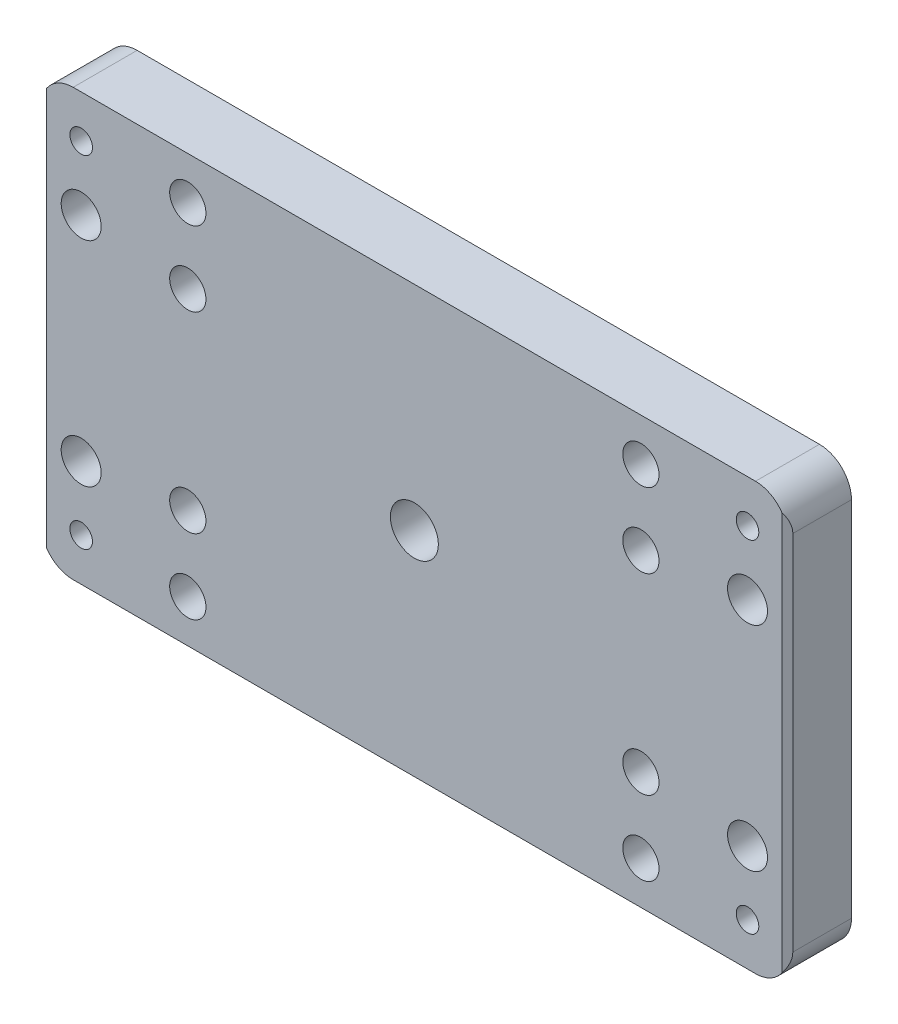
ISO-10303-21;
HEADER;
FILE_DESCRIPTION(('STEP AP214'),'2;1');
FILE_NAME('part.step','',(''),(''),'','','');
FILE_SCHEMA(('AUTOMOTIVE_DESIGN { 1 0 10303 214 1 1 1 1 }'));
ENDSEC;
DATA;
#1=APPLICATION_CONTEXT('core data for automotive mechanical design processes');
#2=APPLICATION_PROTOCOL_DEFINITION('international standard','automotive_design',2000,#1);
#3=PRODUCT_CONTEXT('',#1,'mechanical');
#4=PRODUCT('Part','Part','',(#3));
#5=PRODUCT_RELATED_PRODUCT_CATEGORY('part','',(#4));
#6=PRODUCT_DEFINITION_FORMATION('','',#4);
#7=PRODUCT_DEFINITION_CONTEXT('part definition',#1,'design');
#8=PRODUCT_DEFINITION('design','',#6,#7);
#9=PRODUCT_DEFINITION_SHAPE('','',#8);
#10=(LENGTH_UNIT() NAMED_UNIT(*) SI_UNIT(.MILLI.,.METRE.));
#11=(NAMED_UNIT(*) PLANE_ANGLE_UNIT() SI_UNIT($,.RADIAN.));
#12=(NAMED_UNIT(*) SI_UNIT($,.STERADIAN.) SOLID_ANGLE_UNIT());
#13=UNCERTAINTY_MEASURE_WITH_UNIT(LENGTH_MEASURE(1.E-05),#10,'distance_accuracy_value','');
#14=(GEOMETRIC_REPRESENTATION_CONTEXT(3) GLOBAL_UNCERTAINTY_ASSIGNED_CONTEXT((#13)) GLOBAL_UNIT_ASSIGNED_CONTEXT((#10,
#11,#12)) REPRESENTATION_CONTEXT('',''));
#15=CARTESIAN_POINT('',(0.,0.,0.));
#16=DIRECTION('',(0.,0.,1.));
#17=DIRECTION('',(1.,0.,0.));
#18=AXIS2_PLACEMENT_3D('',#15,#16,#17);
#19=CARTESIAN_POINT('',(0.,0.,12.));
#20=DIRECTION('',(0.,0.,-1.));
#21=DIRECTION('',(-1.,0.,0.));
#22=AXIS2_PLACEMENT_3D('',#19,#20,#21);
#23=PLANE('',#22);
#24=CARTESIAN_POINT('',(-42.5000023711444,32.,12.));
#25=DIRECTION('',(0.,0.,1.));
#26=DIRECTION('',(1.,0.,0.));
#27=AXIS2_PLACEMENT_3D('',#24,#25,#26);
#28=CIRCLE('',#27,3.4);
#29=CARTESIAN_POINT('',(-39.1000023711444,32.,12.));
#30=VERTEX_POINT('',#29);
#31=EDGE_CURVE('E659',#30,#30,#28,.T.);
#32=ORIENTED_EDGE('',*,*,#31,.F.);
#33=EDGE_LOOP('',(#32));
#34=FACE_BOUND('',#33,.T.);
#35=CARTESIAN_POINT('',(-42.5000023711445,18.,12.));
#36=DIRECTION('',(0.,0.,1.));
#37=DIRECTION('',(1.,0.,0.));
#38=AXIS2_PLACEMENT_3D('',#35,#36,#37);
#39=CIRCLE('',#38,3.4);
#40=CARTESIAN_POINT('',(-39.1000023711445,18.,12.));
#41=VERTEX_POINT('',#40);
#42=EDGE_CURVE('E666',#41,#41,#39,.T.);
#43=ORIENTED_EDGE('',*,*,#42,.F.);
#44=EDGE_LOOP('',(#43));
#45=FACE_BOUND('',#44,.T.);
#46=CARTESIAN_POINT('',(42.4999976288555,17.9999999999982,12.));
#47=DIRECTION('',(0.,0.,1.));
#48=DIRECTION('',(1.,0.,0.));
#49=AXIS2_PLACEMENT_3D('',#46,#47,#48);
#50=CIRCLE('',#49,3.4);
#51=CARTESIAN_POINT('',(45.8999976288555,17.9999999999982,12.));
#52=VERTEX_POINT('',#51);
#53=EDGE_CURVE('E673',#52,#52,#50,.T.);
#54=ORIENTED_EDGE('',*,*,#53,.F.);
#55=EDGE_LOOP('',(#54));
#56=FACE_BOUND('',#55,.T.);
#57=CARTESIAN_POINT('',(42.4999976288556,-18.0000000000018,12.));
#58=DIRECTION('',(0.,0.,1.));
#59=DIRECTION('',(1.,0.,0.));
#60=AXIS2_PLACEMENT_3D('',#57,#58,#59);
#61=CIRCLE('',#60,3.4);
#62=CARTESIAN_POINT('',(45.8999976288556,-18.0000000000018,12.));
#63=VERTEX_POINT('',#62);
#64=EDGE_CURVE('E624',#63,#63,#61,.T.);
#65=ORIENTED_EDGE('',*,*,#64,.F.);
#66=EDGE_LOOP('',(#65));
#67=FACE_BOUND('',#66,.T.);
#68=CARTESIAN_POINT('',(42.4999976288555,-32.0000000000018,12.));
#69=DIRECTION('',(0.,0.,1.));
#70=DIRECTION('',(1.,0.,0.));
#71=AXIS2_PLACEMENT_3D('',#68,#69,#70);
#72=CIRCLE('',#71,3.4);
#73=CARTESIAN_POINT('',(45.8999976288555,-32.0000000000018,12.));
#74=VERTEX_POINT('',#73);
#75=EDGE_CURVE('E632',#74,#74,#72,.T.);
#76=ORIENTED_EDGE('',*,*,#75,.F.);
#77=EDGE_LOOP('',(#76));
#78=FACE_BOUND('',#77,.T.);
#79=CARTESIAN_POINT('',(-42.5000023711445,-32.,12.));
#80=DIRECTION('',(0.,0.,1.));
#81=DIRECTION('',(1.,0.,0.));
#82=AXIS2_PLACEMENT_3D('',#79,#80,#81);
#83=CIRCLE('',#82,3.4);
#84=CARTESIAN_POINT('',(-39.1000023711445,-32.,12.));
#85=VERTEX_POINT('',#84);
#86=EDGE_CURVE('E641',#85,#85,#83,.T.);
#87=ORIENTED_EDGE('',*,*,#86,.F.);
#88=EDGE_LOOP('',(#87));
#89=FACE_BOUND('',#88,.T.);
#90=CARTESIAN_POINT('',(-42.5000023711444,-18.,12.));
#91=DIRECTION('',(0.,0.,1.));
#92=DIRECTION('',(1.,0.,0.));
#93=AXIS2_PLACEMENT_3D('',#90,#91,#92);
#94=CIRCLE('',#93,3.4);
#95=CARTESIAN_POINT('',(-39.1000023711444,-18.,12.));
#96=VERTEX_POINT('',#95);
#97=EDGE_CURVE('E653',#96,#96,#94,.T.);
#98=ORIENTED_EDGE('',*,*,#97,.F.);
#99=EDGE_LOOP('',(#98));
#100=FACE_BOUND('',#99,.T.);
#101=CARTESIAN_POINT('',(42.4999976288556,31.9999999999982,12.));
#102=DIRECTION('',(0.,0.,1.));
#103=DIRECTION('',(1.,0.,0.));
#104=AXIS2_PLACEMENT_3D('',#101,#102,#103);
#105=CIRCLE('',#104,3.4);
#106=CARTESIAN_POINT('',(45.8999976288556,31.9999999999982,12.));
#107=VERTEX_POINT('',#106);
#108=EDGE_CURVE('E577',#107,#107,#105,.T.);
#109=ORIENTED_EDGE('',*,*,#108,.F.);
#110=EDGE_LOOP('',(#109));
#111=FACE_BOUND('',#110,.T.);
#112=CARTESIAN_POINT('',(64.,-34.0000000000002,12.));
#113=DIRECTION('',(0.,0.,-1.));
#114=DIRECTION('',(-1.,0.,0.));
#115=AXIS2_PLACEMENT_3D('',#112,#113,#114);
#116=CIRCLE('',#115,6.);
#117=CARTESIAN_POINT('',(64.,-40.0000000000002,12.));
#118=VERTEX_POINT('',#117);
#119=CARTESIAN_POINT('',(69.,-37.3166247903556,12.));
#120=VERTEX_POINT('',#119);
#121=EDGE_CURVE('E187',#118,#120,#116,.F.);
#122=ORIENTED_EDGE('',*,*,#121,.T.);
#123=DIRECTION('',(0.,1.,0.));
#124=VECTOR('',#123,1.);
#125=CARTESIAN_POINT('',(69.,0.,12.));
#126=LINE('',#125,#124);
#127=CARTESIAN_POINT('',(69.,37.3166247903553,12.));
#128=VERTEX_POINT('',#127);
#129=EDGE_CURVE('E202',#120,#128,#126,.T.);
#130=ORIENTED_EDGE('',*,*,#129,.T.);
#131=CARTESIAN_POINT('',(64.,33.9999999999999,12.));
#132=DIRECTION('',(0.,0.,-1.));
#133=DIRECTION('',(-1.,0.,0.));
#134=AXIS2_PLACEMENT_3D('',#131,#132,#133);
#135=CIRCLE('',#134,6.);
#136=CARTESIAN_POINT('',(64.,39.9999999999999,12.));
#137=VERTEX_POINT('',#136);
#138=EDGE_CURVE('E185',#128,#137,#135,.F.);
#139=ORIENTED_EDGE('',*,*,#138,.T.);
#140=DIRECTION('',(-1.,0.,0.));
#141=VECTOR('',#140,1.);
#142=CARTESIAN_POINT('',(-70.,40.,12.));
#143=LINE('',#142,#141);
#144=CARTESIAN_POINT('',(-64.,40.,12.));
#145=VERTEX_POINT('',#144);
#146=EDGE_CURVE('E170',#137,#145,#143,.T.);
#147=ORIENTED_EDGE('',*,*,#146,.T.);
#148=CARTESIAN_POINT('',(-64.,34.,12.));
#149=DIRECTION('',(0.,0.,-1.));
#150=DIRECTION('',(-1.,0.,0.));
#151=AXIS2_PLACEMENT_3D('',#148,#149,#150);
#152=CIRCLE('',#151,6.);
#153=CARTESIAN_POINT('',(-69.,37.3166247903554,12.));
#154=VERTEX_POINT('',#153);
#155=EDGE_CURVE('E182',#145,#154,#152,.F.);
#156=ORIENTED_EDGE('',*,*,#155,.T.);
#157=DIRECTION('',(0.,-1.,0.));
#158=VECTOR('',#157,1.);
#159=CARTESIAN_POINT('',(-69.,0.,12.));
#160=LINE('',#159,#158);
#161=CARTESIAN_POINT('',(-69.,-37.3166247903556,12.));
#162=VERTEX_POINT('',#161);
#163=EDGE_CURVE('E199',#154,#162,#160,.T.);
#164=ORIENTED_EDGE('',*,*,#163,.T.);
#165=CARTESIAN_POINT('',(-64.,-34.0000000000002,12.));
#166=DIRECTION('',(0.,0.,-1.));
#167=DIRECTION('',(-1.,0.,0.));
#168=AXIS2_PLACEMENT_3D('',#165,#166,#167);
#169=CIRCLE('',#168,6.);
#170=CARTESIAN_POINT('',(-64.,-40.0000000000002,12.));
#171=VERTEX_POINT('',#170);
#172=EDGE_CURVE('E180',#162,#171,#169,.F.);
#173=ORIENTED_EDGE('',*,*,#172,.T.);
#174=DIRECTION('',(1.,0.,0.));
#175=VECTOR('',#174,1.);
#176=CARTESIAN_POINT('',(-70.,-40.0000000000002,12.));
#177=LINE('',#176,#175);
#178=EDGE_CURVE('E163',#171,#118,#177,.T.);
#179=ORIENTED_EDGE('',*,*,#178,.T.);
#180=EDGE_LOOP('',(#122,#130,#139,#147,#156,#164,#173,#179));
#181=FACE_BOUND('',#180,.T.);
#182=CARTESIAN_POINT('',(-62.499963670884,31.9999999999999,12.));
#183=DIRECTION('',(0.,0.,1.));
#184=DIRECTION('',(1.,0.,0.));
#185=AXIS2_PLACEMENT_3D('',#182,#183,#184);
#186=CIRCLE('',#185,2.11700000000003);
#187=CARTESIAN_POINT('',(-60.382963670884,31.9999999999999,12.));
#188=VERTEX_POINT('',#187);
#189=EDGE_CURVE('E153',#188,#188,#186,.T.);
#190=ORIENTED_EDGE('',*,*,#189,.F.);
#191=EDGE_LOOP('',(#190));
#192=FACE_BOUND('',#191,.T.);
#193=CARTESIAN_POINT('',(-62.5000023711479,20.0002132500231,12.));
#194=DIRECTION('',(0.,0.,1.));
#195=DIRECTION('',(1.,0.,0.));
#196=AXIS2_PLACEMENT_3D('',#193,#194,#195);
#197=CIRCLE('',#196,3.74999999999998);
#198=CARTESIAN_POINT('',(-58.750002371148,20.0002132500231,12.));
#199=VERTEX_POINT('',#198);
#200=EDGE_CURVE('E227',#199,#199,#197,.T.);
#201=ORIENTED_EDGE('',*,*,#200,.F.);
#202=EDGE_LOOP('',(#201));
#203=FACE_BOUND('',#202,.T.);
#204=CARTESIAN_POINT('',(-62.499963670884,-32.0000000000001,12.));
#205=DIRECTION('',(0.,0.,1.));
#206=DIRECTION('',(1.,0.,0.));
#207=AXIS2_PLACEMENT_3D('',#204,#205,#206);
#208=CIRCLE('',#207,2.11700000000003);
#209=CARTESIAN_POINT('',(-60.382963670884,-32.0000000000001,12.));
#210=VERTEX_POINT('',#209);
#211=EDGE_CURVE('E719',#210,#210,#208,.T.);
#212=ORIENTED_EDGE('',*,*,#211,.F.);
#213=EDGE_LOOP('',(#212));
#214=FACE_BOUND('',#213,.T.);
#215=CARTESIAN_POINT('',(-62.5000023711469,-19.9997867499768,12.));
#216=DIRECTION('',(0.,0.,1.));
#217=DIRECTION('',(1.,0.,0.));
#218=AXIS2_PLACEMENT_3D('',#215,#216,#217);
#219=CIRCLE('',#218,3.74999999999998);
#220=CARTESIAN_POINT('',(-58.750002371147,-19.9997867499768,12.));
#221=VERTEX_POINT('',#220);
#222=EDGE_CURVE('E726',#221,#221,#219,.T.);
#223=ORIENTED_EDGE('',*,*,#222,.F.);
#224=EDGE_LOOP('',(#223));
#225=FACE_BOUND('',#224,.T.);
#226=CARTESIAN_POINT('',(0.,0.,12.));
#227=DIRECTION('',(0.,0.,1.));
#228=DIRECTION('',(1.,0.,0.));
#229=AXIS2_PLACEMENT_3D('',#226,#227,#228);
#230=CIRCLE('',#229,4.49999999999999);
#231=CARTESIAN_POINT('',(4.50000000000002,0.,12.));
#232=VERTEX_POINT('',#231);
#233=EDGE_CURVE('E604',#232,#232,#230,.T.);
#234=ORIENTED_EDGE('',*,*,#233,.F.);
#235=EDGE_LOOP('',(#234));
#236=FACE_BOUND('',#235,.T.);
#237=CARTESIAN_POINT('',(62.499963670884,31.9999999999999,12.));
#238=DIRECTION('',(0.,0.,1.));
#239=DIRECTION('',(1.,0.,0.));
#240=AXIS2_PLACEMENT_3D('',#237,#238,#239);
#241=CIRCLE('',#240,2.117);
#242=CARTESIAN_POINT('',(64.616963670884,31.9999999999999,12.));
#243=VERTEX_POINT('',#242);
#244=EDGE_CURVE('E597',#243,#243,#241,.T.);
#245=ORIENTED_EDGE('',*,*,#244,.F.);
#246=EDGE_LOOP('',(#245));
#247=FACE_BOUND('',#246,.T.);
#248=CARTESIAN_POINT('',(62.499997628858,20.0002132500231,12.));
#249=DIRECTION('',(0.,0.,1.));
#250=DIRECTION('',(1.,0.,0.));
#251=AXIS2_PLACEMENT_3D('',#248,#249,#250);
#252=CIRCLE('',#251,3.75);
#253=CARTESIAN_POINT('',(66.249997628858,20.0002132500231,12.));
#254=VERTEX_POINT('',#253);
#255=EDGE_CURVE('E591',#254,#254,#252,.T.);
#256=ORIENTED_EDGE('',*,*,#255,.F.);
#257=EDGE_LOOP('',(#256));
#258=FACE_BOUND('',#257,.T.);
#259=CARTESIAN_POINT('',(62.499997628858,-19.9997867499768,12.));
#260=DIRECTION('',(0.,0.,1.));
#261=DIRECTION('',(1.,0.,0.));
#262=AXIS2_PLACEMENT_3D('',#259,#260,#261);
#263=CIRCLE('',#262,3.75000000000001);
#264=CARTESIAN_POINT('',(66.249997628858,-19.9997867499768,12.));
#265=VERTEX_POINT('',#264);
#266=EDGE_CURVE('E582',#265,#265,#263,.T.);
#267=ORIENTED_EDGE('',*,*,#266,.F.);
#268=EDGE_LOOP('',(#267));
#269=FACE_BOUND('',#268,.T.);
#270=CARTESIAN_POINT('',(62.499963670884,-32.0000000000001,12.));
#271=DIRECTION('',(0.,0.,1.));
#272=DIRECTION('',(1.,0.,0.));
#273=AXIS2_PLACEMENT_3D('',#270,#271,#272);
#274=CIRCLE('',#273,2.117);
#275=CARTESIAN_POINT('',(64.616963670884,-32.0000000000001,12.));
#276=VERTEX_POINT('',#275);
#277=EDGE_CURVE('E569',#276,#276,#274,.T.);
#278=ORIENTED_EDGE('',*,*,#277,.F.);
#279=EDGE_LOOP('',(#278));
#280=FACE_BOUND('',#279,.T.);
#281=ADVANCED_FACE('F45',(#34,#45,#56,#67,#78,#89,#100,#111,#181,#192,#203,#214,#225,#236,#247,
#258,#269,#280),#23,.F.);
#282=CARTESIAN_POINT('',(0.,0.,0.));
#283=DIRECTION('',(0.,0.,-1.));
#284=DIRECTION('',(-1.,0.,0.));
#285=AXIS2_PLACEMENT_3D('',#282,#283,#284);
#286=PLANE('',#285);
#287=CARTESIAN_POINT('',(-42.5000023711444,32.,0.));
#288=DIRECTION('',(0.,0.,1.));
#289=DIRECTION('',(1.,0.,0.));
#290=AXIS2_PLACEMENT_3D('',#287,#288,#289);
#291=CIRCLE('',#290,3.4);
#292=CARTESIAN_POINT('',(-39.1000023711444,32.,0.));
#293=VERTEX_POINT('',#292);
#294=EDGE_CURVE('E622',#293,#293,#291,.T.);
#295=ORIENTED_EDGE('',*,*,#294,.T.);
#296=EDGE_LOOP('',(#295));
#297=FACE_BOUND('',#296,.T.);
#298=CARTESIAN_POINT('',(-42.5000023711445,18.,0.));
#299=DIRECTION('',(0.,0.,1.));
#300=DIRECTION('',(1.,0.,0.));
#301=AXIS2_PLACEMENT_3D('',#298,#299,#300);
#302=CIRCLE('',#301,3.4);
#303=CARTESIAN_POINT('',(-39.1000023711445,18.,0.));
#304=VERTEX_POINT('',#303);
#305=EDGE_CURVE('E664',#304,#304,#302,.T.);
#306=ORIENTED_EDGE('',*,*,#305,.T.);
#307=EDGE_LOOP('',(#306));
#308=FACE_BOUND('',#307,.T.);
#309=CARTESIAN_POINT('',(42.4999976288555,17.9999999999982,0.));
#310=DIRECTION('',(0.,0.,1.));
#311=DIRECTION('',(1.,0.,0.));
#312=AXIS2_PLACEMENT_3D('',#309,#310,#311);
#313=CIRCLE('',#312,3.4);
#314=CARTESIAN_POINT('',(45.8999976288555,17.9999999999982,0.));
#315=VERTEX_POINT('',#314);
#316=EDGE_CURVE('E671',#315,#315,#313,.T.);
#317=ORIENTED_EDGE('',*,*,#316,.T.);
#318=EDGE_LOOP('',(#317));
#319=FACE_BOUND('',#318,.T.);
#320=CARTESIAN_POINT('',(42.4999976288556,-18.0000000000018,0.));
#321=DIRECTION('',(0.,0.,1.));
#322=DIRECTION('',(1.,0.,0.));
#323=AXIS2_PLACEMENT_3D('',#320,#321,#322);
#324=CIRCLE('',#323,3.4);
#325=CARTESIAN_POINT('',(45.8999976288556,-18.0000000000018,0.));
#326=VERTEX_POINT('',#325);
#327=EDGE_CURVE('E629',#326,#326,#324,.T.);
#328=ORIENTED_EDGE('',*,*,#327,.T.);
#329=EDGE_LOOP('',(#328));
#330=FACE_BOUND('',#329,.T.);
#331=CARTESIAN_POINT('',(42.4999976288555,-32.0000000000018,0.));
#332=DIRECTION('',(0.,0.,1.));
#333=DIRECTION('',(1.,0.,0.));
#334=AXIS2_PLACEMENT_3D('',#331,#332,#333);
#335=CIRCLE('',#334,3.4);
#336=CARTESIAN_POINT('',(45.8999976288555,-32.0000000000018,0.));
#337=VERTEX_POINT('',#336);
#338=EDGE_CURVE('E630',#337,#337,#335,.T.);
#339=ORIENTED_EDGE('',*,*,#338,.T.);
#340=EDGE_LOOP('',(#339));
#341=FACE_BOUND('',#340,.T.);
#342=CARTESIAN_POINT('',(-42.5000023711445,-32.,0.));
#343=DIRECTION('',(0.,0.,1.));
#344=DIRECTION('',(1.,0.,0.));
#345=AXIS2_PLACEMENT_3D('',#342,#343,#344);
#346=CIRCLE('',#345,3.4);
#347=CARTESIAN_POINT('',(-39.1000023711445,-32.,0.));
#348=VERTEX_POINT('',#347);
#349=EDGE_CURVE('E638',#348,#348,#346,.T.);
#350=ORIENTED_EDGE('',*,*,#349,.T.);
#351=EDGE_LOOP('',(#350));
#352=FACE_BOUND('',#351,.T.);
#353=CARTESIAN_POINT('',(-42.5000023711444,-18.,0.));
#354=DIRECTION('',(0.,0.,1.));
#355=DIRECTION('',(1.,0.,0.));
#356=AXIS2_PLACEMENT_3D('',#353,#354,#355);
#357=CIRCLE('',#356,3.4);
#358=CARTESIAN_POINT('',(-39.1000023711444,-18.,0.));
#359=VERTEX_POINT('',#358);
#360=EDGE_CURVE('E646',#359,#359,#357,.T.);
#361=ORIENTED_EDGE('',*,*,#360,.T.);
#362=EDGE_LOOP('',(#361));
#363=FACE_BOUND('',#362,.T.);
#364=CARTESIAN_POINT('',(42.4999976288556,31.9999999999982,0.));
#365=DIRECTION('',(0.,0.,1.));
#366=DIRECTION('',(1.,0.,0.));
#367=AXIS2_PLACEMENT_3D('',#364,#365,#366);
#368=CIRCLE('',#367,3.4);
#369=CARTESIAN_POINT('',(45.8999976288556,31.9999999999982,0.));
#370=VERTEX_POINT('',#369);
#371=EDGE_CURVE('E570',#370,#370,#368,.T.);
#372=ORIENTED_EDGE('',*,*,#371,.T.);
#373=EDGE_LOOP('',(#372));
#374=FACE_BOUND('',#373,.T.);
#375=CARTESIAN_POINT('',(62.499997628858,-19.9997867499768,0.));
#376=DIRECTION('',(0.,0.,1.));
#377=DIRECTION('',(1.,0.,0.));
#378=AXIS2_PLACEMENT_3D('',#375,#376,#377);
#379=CIRCLE('',#378,3.75000000000001);
#380=CARTESIAN_POINT('',(66.249997628858,-19.9997867499768,0.));
#381=VERTEX_POINT('',#380);
#382=EDGE_CURVE('E574',#381,#381,#379,.T.);
#383=ORIENTED_EDGE('',*,*,#382,.T.);
#384=EDGE_LOOP('',(#383));
#385=FACE_BOUND('',#384,.T.);
#386=CARTESIAN_POINT('',(62.499963670884,31.9999999999999,0.));
#387=DIRECTION('',(0.,0.,1.));
#388=DIRECTION('',(1.,0.,0.));
#389=AXIS2_PLACEMENT_3D('',#386,#387,#388);
#390=CIRCLE('',#389,2.117);
#391=CARTESIAN_POINT('',(64.616963670884,31.9999999999999,0.));
#392=VERTEX_POINT('',#391);
#393=EDGE_CURVE('E596',#392,#392,#390,.T.);
#394=ORIENTED_EDGE('',*,*,#393,.T.);
#395=EDGE_LOOP('',(#394));
#396=FACE_BOUND('',#395,.T.);
#397=CARTESIAN_POINT('',(-62.5000023711469,-19.9997867499768,0.));
#398=DIRECTION('',(0.,0.,1.));
#399=DIRECTION('',(1.,0.,0.));
#400=AXIS2_PLACEMENT_3D('',#397,#398,#399);
#401=CIRCLE('',#400,3.74999999999998);
#402=CARTESIAN_POINT('',(-58.750002371147,-19.9997867499768,0.));
#403=VERTEX_POINT('',#402);
#404=EDGE_CURVE('E609',#403,#403,#401,.T.);
#405=ORIENTED_EDGE('',*,*,#404,.T.);
#406=EDGE_LOOP('',(#405));
#407=FACE_BOUND('',#406,.T.);
#408=CARTESIAN_POINT('',(-62.5000023711479,20.0002132500231,0.));
#409=DIRECTION('',(0.,0.,1.));
#410=DIRECTION('',(1.,0.,0.));
#411=AXIS2_PLACEMENT_3D('',#408,#409,#410);
#412=CIRCLE('',#411,3.74999999999998);
#413=CARTESIAN_POINT('',(-58.750002371148,20.0002132500231,0.));
#414=VERTEX_POINT('',#413);
#415=EDGE_CURVE('E225',#414,#414,#412,.T.);
#416=ORIENTED_EDGE('',*,*,#415,.T.);
#417=EDGE_LOOP('',(#416));
#418=FACE_BOUND('',#417,.T.);
#419=DIRECTION('',(0.,1.,0.));
#420=VECTOR('',#419,1.);
#421=CARTESIAN_POINT('',(70.,-40.0000000000002,0.));
#422=LINE('',#421,#420);
#423=CARTESIAN_POINT('',(70.,-34.0000000000002,0.));
#424=VERTEX_POINT('',#423);
#425=CARTESIAN_POINT('',(70.,33.9999999999999,0.));
#426=VERTEX_POINT('',#425);
#427=EDGE_CURVE('E129',#424,#426,#422,.T.);
#428=ORIENTED_EDGE('',*,*,#427,.F.);
#429=CARTESIAN_POINT('',(64.,-34.0000000000002,0.));
#430=DIRECTION('',(0.,0.,-1.));
#431=DIRECTION('',(-1.,0.,0.));
#432=AXIS2_PLACEMENT_3D('',#429,#430,#431);
#433=CIRCLE('',#432,6.);
#434=CARTESIAN_POINT('',(64.,-40.0000000000002,0.));
#435=VERTEX_POINT('',#434);
#436=EDGE_CURVE('E139',#424,#435,#433,.T.);
#437=ORIENTED_EDGE('',*,*,#436,.T.);
#438=DIRECTION('',(1.,0.,0.));
#439=VECTOR('',#438,1.);
#440=CARTESIAN_POINT('',(-70.,-40.0000000000002,0.));
#441=LINE('',#440,#439);
#442=CARTESIAN_POINT('',(-64.,-40.0000000000002,0.));
#443=VERTEX_POINT('',#442);
#444=EDGE_CURVE('E168',#443,#435,#441,.T.);
#445=ORIENTED_EDGE('',*,*,#444,.F.);
#446=CARTESIAN_POINT('',(-64.,-34.0000000000002,0.));
#447=DIRECTION('',(0.,0.,-1.));
#448=DIRECTION('',(-1.,0.,0.));
#449=AXIS2_PLACEMENT_3D('',#446,#447,#448);
#450=CIRCLE('',#449,6.);
#451=CARTESIAN_POINT('',(-70.,-34.0000000000002,0.));
#452=VERTEX_POINT('',#451);
#453=EDGE_CURVE('E135',#443,#452,#450,.T.);
#454=ORIENTED_EDGE('',*,*,#453,.T.);
#455=DIRECTION('',(0.,-1.,0.));
#456=VECTOR('',#455,1.);
#457=CARTESIAN_POINT('',(-70.,-40.0000000000002,0.));
#458=LINE('',#457,#456);
#459=CARTESIAN_POINT('',(-70.,34.,0.));
#460=VERTEX_POINT('',#459);
#461=EDGE_CURVE('E156',#460,#452,#458,.T.);
#462=ORIENTED_EDGE('',*,*,#461,.F.);
#463=CARTESIAN_POINT('',(-64.,34.,0.));
#464=DIRECTION('',(0.,0.,-1.));
#465=DIRECTION('',(-1.,0.,0.));
#466=AXIS2_PLACEMENT_3D('',#463,#464,#465);
#467=CIRCLE('',#466,6.);
#468=CARTESIAN_POINT('',(-64.,40.,0.));
#469=VERTEX_POINT('',#468);
#470=EDGE_CURVE('E174',#460,#469,#467,.T.);
#471=ORIENTED_EDGE('',*,*,#470,.T.);
#472=DIRECTION('',(-1.,0.,0.));
#473=VECTOR('',#472,1.);
#474=CARTESIAN_POINT('',(-70.,40.,0.));
#475=LINE('',#474,#473);
#476=CARTESIAN_POINT('',(64.,39.9999999999999,0.));
#477=VERTEX_POINT('',#476);
#478=EDGE_CURVE('E152',#477,#469,#475,.T.);
#479=ORIENTED_EDGE('',*,*,#478,.F.);
#480=CARTESIAN_POINT('',(64.,33.9999999999999,0.));
#481=DIRECTION('',(0.,0.,-1.));
#482=DIRECTION('',(-1.,0.,0.));
#483=AXIS2_PLACEMENT_3D('',#480,#481,#482);
#484=CIRCLE('',#483,6.);
#485=EDGE_CURVE('E147',#477,#426,#484,.T.);
#486=ORIENTED_EDGE('',*,*,#485,.T.);
#487=EDGE_LOOP('',(#428,#437,#445,#454,#462,#471,#479,#486));
#488=FACE_BOUND('',#487,.T.);
#489=CARTESIAN_POINT('',(-62.499963670884,31.9999999999999,0.));
#490=DIRECTION('',(0.,0.,1.));
#491=DIRECTION('',(1.,0.,0.));
#492=AXIS2_PLACEMENT_3D('',#489,#490,#491);
#493=CIRCLE('',#492,2.11700000000003);
#494=CARTESIAN_POINT('',(-60.382963670884,31.9999999999999,0.));
#495=VERTEX_POINT('',#494);
#496=EDGE_CURVE('E160',#495,#495,#493,.T.);
#497=ORIENTED_EDGE('',*,*,#496,.T.);
#498=EDGE_LOOP('',(#497));
#499=FACE_BOUND('',#498,.T.);
#500=CARTESIAN_POINT('',(-62.499963670884,-32.0000000000001,0.));
#501=DIRECTION('',(0.,0.,1.));
#502=DIRECTION('',(1.,0.,0.));
#503=AXIS2_PLACEMENT_3D('',#500,#501,#502);
#504=CIRCLE('',#503,2.11700000000003);
#505=CARTESIAN_POINT('',(-60.382963670884,-32.0000000000001,0.));
#506=VERTEX_POINT('',#505);
#507=EDGE_CURVE('E556',#506,#506,#504,.T.);
#508=ORIENTED_EDGE('',*,*,#507,.T.);
#509=EDGE_LOOP('',(#508));
#510=FACE_BOUND('',#509,.T.);
#511=CARTESIAN_POINT('',(0.,0.,0.));
#512=DIRECTION('',(0.,0.,1.));
#513=DIRECTION('',(1.,0.,0.));
#514=AXIS2_PLACEMENT_3D('',#511,#512,#513);
#515=CIRCLE('',#514,4.49999999999999);
#516=CARTESIAN_POINT('',(4.50000000000002,0.,0.));
#517=VERTEX_POINT('',#516);
#518=EDGE_CURVE('E560',#517,#517,#515,.T.);
#519=ORIENTED_EDGE('',*,*,#518,.T.);
#520=EDGE_LOOP('',(#519));
#521=FACE_BOUND('',#520,.T.);
#522=CARTESIAN_POINT('',(62.499997628858,20.0002132500231,0.));
#523=DIRECTION('',(0.,0.,1.));
#524=DIRECTION('',(1.,0.,0.));
#525=AXIS2_PLACEMENT_3D('',#522,#523,#524);
#526=CIRCLE('',#525,3.75);
#527=CARTESIAN_POINT('',(66.249997628858,20.0002132500231,0.));
#528=VERTEX_POINT('',#527);
#529=EDGE_CURVE('E564',#528,#528,#526,.T.);
#530=ORIENTED_EDGE('',*,*,#529,.T.);
#531=EDGE_LOOP('',(#530));
#532=FACE_BOUND('',#531,.T.);
#533=CARTESIAN_POINT('',(62.499963670884,-32.0000000000001,0.));
#534=DIRECTION('',(0.,0.,1.));
#535=DIRECTION('',(1.,0.,0.));
#536=AXIS2_PLACEMENT_3D('',#533,#534,#535);
#537=CIRCLE('',#536,2.117);
#538=CARTESIAN_POINT('',(64.616963670884,-32.0000000000001,0.));
#539=VERTEX_POINT('',#538);
#540=EDGE_CURVE('E567',#539,#539,#537,.T.);
#541=ORIENTED_EDGE('',*,*,#540,.T.);
#542=EDGE_LOOP('',(#541));
#543=FACE_BOUND('',#542,.T.);
#544=ADVANCED_FACE('F149',(#297,#308,#319,#330,#341,#352,#363,#374,#385,#396,#407,#418,#488,
#499,#510,#521,#532,#543),#286,.T.);
#545=CARTESIAN_POINT('',(70.,-40.0000000000002,12.));
#546=DIRECTION('',(-1.,0.,0.));
#547=DIRECTION('',(0.,0.,1.));
#548=AXIS2_PLACEMENT_3D('',#545,#546,#547);
#549=PLANE('',#548);
#550=DIRECTION('',(0.,0.,-1.));
#551=VECTOR('',#550,1.);
#552=CARTESIAN_POINT('',(70.,33.9999999999999,12.));
#553=LINE('',#552,#551);
#554=CARTESIAN_POINT('',(70.,33.9999999999999,11.));
#555=VERTEX_POINT('',#554);
#556=EDGE_CURVE('E136',#426,#555,#553,.F.);
#557=ORIENTED_EDGE('',*,*,#556,.T.);
#558=DIRECTION('',(0.,-1.,0.));
#559=VECTOR('',#558,1.);
#560=CARTESIAN_POINT('',(70.,-40.0000000000002,11.));
#561=LINE('',#560,#559);
#562=CARTESIAN_POINT('',(70.,-34.0000000000002,11.));
#563=VERTEX_POINT('',#562);
#564=EDGE_CURVE('E132',#555,#563,#561,.T.);
#565=ORIENTED_EDGE('',*,*,#564,.T.);
#566=DIRECTION('',(0.,0.,-1.));
#567=VECTOR('',#566,1.);
#568=CARTESIAN_POINT('',(70.,-34.0000000000002,12.));
#569=LINE('',#568,#567);
#570=EDGE_CURVE('E124',#563,#424,#569,.T.);
#571=ORIENTED_EDGE('',*,*,#570,.T.);
#572=ORIENTED_EDGE('',*,*,#427,.T.);
#573=EDGE_LOOP('',(#557,#565,#571,#572));
#574=FACE_BOUND('',#573,.T.);
#575=ADVANCED_FACE('F127',(#574),#549,.F.);
#576=CARTESIAN_POINT('',(-70.,40.,12.));
#577=DIRECTION('',(0.,-1.,0.));
#578=DIRECTION('',(1.,0.,0.));
#579=AXIS2_PLACEMENT_3D('',#576,#577,#578);
#580=PLANE('',#579);
#581=ORIENTED_EDGE('',*,*,#146,.F.);
#582=DIRECTION('',(0.,0.,-1.));
#583=VECTOR('',#582,1.);
#584=CARTESIAN_POINT('',(64.,39.9999999999999,12.));
#585=LINE('',#584,#583);
#586=EDGE_CURVE('E192',#137,#477,#585,.T.);
#587=ORIENTED_EDGE('',*,*,#586,.T.);
#588=ORIENTED_EDGE('',*,*,#478,.T.);
#589=DIRECTION('',(0.,0.,-1.));
#590=VECTOR('',#589,1.);
#591=CARTESIAN_POINT('',(-64.,40.,12.));
#592=LINE('',#591,#590);
#593=EDGE_CURVE('E190',#469,#145,#592,.F.);
#594=ORIENTED_EDGE('',*,*,#593,.T.);
#595=EDGE_LOOP('',(#581,#587,#588,#594));
#596=FACE_BOUND('',#595,.T.);
#597=ADVANCED_FACE('F245',(#596),#580,.F.);
#598=CARTESIAN_POINT('',(-70.,-40.0000000000002,12.));
#599=DIRECTION('',(1.,0.,0.));
#600=DIRECTION('',(0.,0.,-1.));
#601=AXIS2_PLACEMENT_3D('',#598,#599,#600);
#602=PLANE('',#601);
#603=DIRECTION('',(0.,0.,-1.));
#604=VECTOR('',#603,1.);
#605=CARTESIAN_POINT('',(-70.,-34.0000000000002,12.));
#606=LINE('',#605,#604);
#607=CARTESIAN_POINT('',(-70.,-34.0000000000002,11.));
#608=VERTEX_POINT('',#607);
#609=EDGE_CURVE('E195',#452,#608,#606,.F.);
#610=ORIENTED_EDGE('',*,*,#609,.T.);
#611=DIRECTION('',(0.,1.,0.));
#612=VECTOR('',#611,1.);
#613=CARTESIAN_POINT('',(-70.,-40.0000000000002,11.));
#614=LINE('',#613,#612);
#615=CARTESIAN_POINT('',(-70.,34.,11.));
#616=VERTEX_POINT('',#615);
#617=EDGE_CURVE('E56',#608,#616,#614,.T.);
#618=ORIENTED_EDGE('',*,*,#617,.T.);
#619=DIRECTION('',(0.,0.,-1.));
#620=VECTOR('',#619,1.);
#621=CARTESIAN_POINT('',(-70.,34.,12.));
#622=LINE('',#621,#620);
#623=EDGE_CURVE('E197',#616,#460,#622,.T.);
#624=ORIENTED_EDGE('',*,*,#623,.T.);
#625=ORIENTED_EDGE('',*,*,#461,.T.);
#626=EDGE_LOOP('',(#610,#618,#624,#625));
#627=FACE_BOUND('',#626,.T.);
#628=ADVANCED_FACE('F276',(#627),#602,.F.);
#629=CARTESIAN_POINT('',(-70.,-40.0000000000002,12.));
#630=DIRECTION('',(0.,1.,0.));
#631=DIRECTION('',(0.,0.,1.));
#632=AXIS2_PLACEMENT_3D('',#629,#630,#631);
#633=PLANE('',#632);
#634=ORIENTED_EDGE('',*,*,#444,.T.);
#635=DIRECTION('',(0.,0.,-1.));
#636=VECTOR('',#635,1.);
#637=CARTESIAN_POINT('',(64.,-40.0000000000002,12.));
#638=LINE('',#637,#636);
#639=EDGE_CURVE('E142',#435,#118,#638,.F.);
#640=ORIENTED_EDGE('',*,*,#639,.T.);
#641=ORIENTED_EDGE('',*,*,#178,.F.);
#642=DIRECTION('',(0.,0.,-1.));
#643=VECTOR('',#642,1.);
#644=CARTESIAN_POINT('',(-64.,-40.0000000000002,12.));
#645=LINE('',#644,#643);
#646=EDGE_CURVE('E146',#171,#443,#645,.T.);
#647=ORIENTED_EDGE('',*,*,#646,.T.);
#648=EDGE_LOOP('',(#634,#640,#641,#647));
#649=FACE_BOUND('',#648,.T.);
#650=ADVANCED_FACE('F273',(#649),#633,.F.);
#651=CARTESIAN_POINT('',(-62.499963670884,31.9999999999999,12.));
#652=DIRECTION('',(0.,0.,-1.));
#653=DIRECTION('',(-1.,0.,0.));
#654=AXIS2_PLACEMENT_3D('',#651,#652,#653);
#655=CYLINDRICAL_SURFACE('',#654,2.11700000000003);
#656=ORIENTED_EDGE('',*,*,#189,.T.);
#657=EDGE_LOOP('',(#656));
#658=FACE_BOUND('',#657,.T.);
#659=ORIENTED_EDGE('',*,*,#496,.F.);
#660=EDGE_LOOP('',(#659));
#661=FACE_BOUND('',#660,.T.);
#662=ADVANCED_FACE('F270',(#658,#661),#655,.F.);
#663=CARTESIAN_POINT('',(-62.5000023711479,20.0002132500231,12.));
#664=DIRECTION('',(0.,0.,-1.));
#665=DIRECTION('',(-1.,0.,0.));
#666=AXIS2_PLACEMENT_3D('',#663,#664,#665);
#667=CYLINDRICAL_SURFACE('',#666,3.74999999999998);
#668=ORIENTED_EDGE('',*,*,#200,.T.);
#669=EDGE_LOOP('',(#668));
#670=FACE_BOUND('',#669,.T.);
#671=ORIENTED_EDGE('',*,*,#415,.F.);
#672=EDGE_LOOP('',(#671));
#673=FACE_BOUND('',#672,.T.);
#674=ADVANCED_FACE('F476',(#670,#673),#667,.F.);
#675=CARTESIAN_POINT('',(-62.499963670884,-32.0000000000001,12.));
#676=DIRECTION('',(0.,0.,-1.));
#677=DIRECTION('',(-1.,0.,0.));
#678=AXIS2_PLACEMENT_3D('',#675,#676,#677);
#679=CYLINDRICAL_SURFACE('',#678,2.11700000000003);
#680=ORIENTED_EDGE('',*,*,#211,.T.);
#681=EDGE_LOOP('',(#680));
#682=FACE_BOUND('',#681,.T.);
#683=ORIENTED_EDGE('',*,*,#507,.F.);
#684=EDGE_LOOP('',(#683));
#685=FACE_BOUND('',#684,.T.);
#686=ADVANCED_FACE('F466',(#682,#685),#679,.F.);
#687=CARTESIAN_POINT('',(-62.5000023711469,-19.9997867499768,12.));
#688=DIRECTION('',(0.,0.,-1.));
#689=DIRECTION('',(-1.,0.,0.));
#690=AXIS2_PLACEMENT_3D('',#687,#688,#689);
#691=CYLINDRICAL_SURFACE('',#690,3.74999999999998);
#692=ORIENTED_EDGE('',*,*,#222,.T.);
#693=EDGE_LOOP('',(#692));
#694=FACE_BOUND('',#693,.T.);
#695=ORIENTED_EDGE('',*,*,#404,.F.);
#696=EDGE_LOOP('',(#695));
#697=FACE_BOUND('',#696,.T.);
#698=ADVANCED_FACE('F456',(#694,#697),#691,.F.);
#699=CARTESIAN_POINT('',(0.,0.,12.));
#700=DIRECTION('',(0.,0.,-1.));
#701=DIRECTION('',(-1.,0.,0.));
#702=AXIS2_PLACEMENT_3D('',#699,#700,#701);
#703=CYLINDRICAL_SURFACE('',#702,4.49999999999999);
#704=ORIENTED_EDGE('',*,*,#233,.T.);
#705=EDGE_LOOP('',(#704));
#706=FACE_BOUND('',#705,.T.);
#707=ORIENTED_EDGE('',*,*,#518,.F.);
#708=EDGE_LOOP('',(#707));
#709=FACE_BOUND('',#708,.T.);
#710=ADVANCED_FACE('F446',(#706,#709),#703,.F.);
#711=CARTESIAN_POINT('',(62.499963670884,31.9999999999999,12.));
#712=DIRECTION('',(0.,0.,-1.));
#713=DIRECTION('',(-1.,0.,0.));
#714=AXIS2_PLACEMENT_3D('',#711,#712,#713);
#715=CYLINDRICAL_SURFACE('',#714,2.117);
#716=ORIENTED_EDGE('',*,*,#244,.T.);
#717=EDGE_LOOP('',(#716));
#718=FACE_BOUND('',#717,.T.);
#719=ORIENTED_EDGE('',*,*,#393,.F.);
#720=EDGE_LOOP('',(#719));
#721=FACE_BOUND('',#720,.T.);
#722=ADVANCED_FACE('F436',(#718,#721),#715,.F.);
#723=CARTESIAN_POINT('',(62.499997628858,20.0002132500231,12.));
#724=DIRECTION('',(0.,0.,-1.));
#725=DIRECTION('',(-1.,0.,0.));
#726=AXIS2_PLACEMENT_3D('',#723,#724,#725);
#727=CYLINDRICAL_SURFACE('',#726,3.75);
#728=ORIENTED_EDGE('',*,*,#255,.T.);
#729=EDGE_LOOP('',(#728));
#730=FACE_BOUND('',#729,.T.);
#731=ORIENTED_EDGE('',*,*,#529,.F.);
#732=EDGE_LOOP('',(#731));
#733=FACE_BOUND('',#732,.T.);
#734=ADVANCED_FACE('F426',(#730,#733),#727,.F.);
#735=CARTESIAN_POINT('',(62.499997628858,-19.9997867499768,12.));
#736=DIRECTION('',(0.,0.,-1.));
#737=DIRECTION('',(-1.,0.,0.));
#738=AXIS2_PLACEMENT_3D('',#735,#736,#737);
#739=CYLINDRICAL_SURFACE('',#738,3.75000000000001);
#740=ORIENTED_EDGE('',*,*,#266,.T.);
#741=EDGE_LOOP('',(#740));
#742=FACE_BOUND('',#741,.T.);
#743=ORIENTED_EDGE('',*,*,#382,.F.);
#744=EDGE_LOOP('',(#743));
#745=FACE_BOUND('',#744,.T.);
#746=ADVANCED_FACE('F416',(#742,#745),#739,.F.);
#747=CARTESIAN_POINT('',(62.499963670884,-32.0000000000001,12.));
#748=DIRECTION('',(0.,0.,-1.));
#749=DIRECTION('',(-1.,0.,0.));
#750=AXIS2_PLACEMENT_3D('',#747,#748,#749);
#751=CYLINDRICAL_SURFACE('',#750,2.117);
#752=ORIENTED_EDGE('',*,*,#277,.T.);
#753=EDGE_LOOP('',(#752));
#754=FACE_BOUND('',#753,.T.);
#755=ORIENTED_EDGE('',*,*,#540,.F.);
#756=EDGE_LOOP('',(#755));
#757=FACE_BOUND('',#756,.T.);
#758=ADVANCED_FACE('F406',(#754,#757),#751,.F.);
#759=CARTESIAN_POINT('',(42.4999976288556,31.9999999999982,0.));
#760=DIRECTION('',(0.,0.,1.));
#761=DIRECTION('',(1.,0.,0.));
#762=AXIS2_PLACEMENT_3D('',#759,#760,#761);
#763=CYLINDRICAL_SURFACE('',#762,3.4);
#764=ORIENTED_EDGE('',*,*,#371,.F.);
#765=EDGE_LOOP('',(#764));
#766=FACE_BOUND('',#765,.T.);
#767=ORIENTED_EDGE('',*,*,#108,.T.);
#768=EDGE_LOOP('',(#767));
#769=FACE_BOUND('',#768,.T.);
#770=ADVANCED_FACE('F396',(#766,#769),#763,.F.);
#771=CARTESIAN_POINT('',(-42.5000023711444,-18.,0.));
#772=DIRECTION('',(0.,0.,1.));
#773=DIRECTION('',(1.,0.,0.));
#774=AXIS2_PLACEMENT_3D('',#771,#772,#773);
#775=CYLINDRICAL_SURFACE('',#774,3.4);
#776=ORIENTED_EDGE('',*,*,#360,.F.);
#777=EDGE_LOOP('',(#776));
#778=FACE_BOUND('',#777,.T.);
#779=ORIENTED_EDGE('',*,*,#97,.T.);
#780=EDGE_LOOP('',(#779));
#781=FACE_BOUND('',#780,.T.);
#782=ADVANCED_FACE('F386',(#778,#781),#775,.F.);
#783=CARTESIAN_POINT('',(-42.5000023711445,-32.,0.));
#784=DIRECTION('',(0.,0.,1.));
#785=DIRECTION('',(1.,0.,0.));
#786=AXIS2_PLACEMENT_3D('',#783,#784,#785);
#787=CYLINDRICAL_SURFACE('',#786,3.4);
#788=ORIENTED_EDGE('',*,*,#349,.F.);
#789=EDGE_LOOP('',(#788));
#790=FACE_BOUND('',#789,.T.);
#791=ORIENTED_EDGE('',*,*,#86,.T.);
#792=EDGE_LOOP('',(#791));
#793=FACE_BOUND('',#792,.T.);
#794=ADVANCED_FACE('F376',(#790,#793),#787,.F.);
#795=CARTESIAN_POINT('',(42.4999976288555,-32.0000000000018,0.));
#796=DIRECTION('',(0.,0.,1.));
#797=DIRECTION('',(1.,0.,0.));
#798=AXIS2_PLACEMENT_3D('',#795,#796,#797);
#799=CYLINDRICAL_SURFACE('',#798,3.4);
#800=ORIENTED_EDGE('',*,*,#338,.F.);
#801=EDGE_LOOP('',(#800));
#802=FACE_BOUND('',#801,.T.);
#803=ORIENTED_EDGE('',*,*,#75,.T.);
#804=EDGE_LOOP('',(#803));
#805=FACE_BOUND('',#804,.T.);
#806=ADVANCED_FACE('F366',(#802,#805),#799,.F.);
#807=CARTESIAN_POINT('',(42.4999976288556,-18.0000000000018,0.));
#808=DIRECTION('',(0.,0.,1.));
#809=DIRECTION('',(1.,0.,0.));
#810=AXIS2_PLACEMENT_3D('',#807,#808,#809);
#811=CYLINDRICAL_SURFACE('',#810,3.4);
#812=ORIENTED_EDGE('',*,*,#327,.F.);
#813=EDGE_LOOP('',(#812));
#814=FACE_BOUND('',#813,.T.);
#815=ORIENTED_EDGE('',*,*,#64,.T.);
#816=EDGE_LOOP('',(#815));
#817=FACE_BOUND('',#816,.T.);
#818=ADVANCED_FACE('F356',(#814,#817),#811,.F.);
#819=CARTESIAN_POINT('',(42.4999976288555,17.9999999999982,0.));
#820=DIRECTION('',(0.,0.,1.));
#821=DIRECTION('',(1.,0.,0.));
#822=AXIS2_PLACEMENT_3D('',#819,#820,#821);
#823=CYLINDRICAL_SURFACE('',#822,3.4);
#824=ORIENTED_EDGE('',*,*,#316,.F.);
#825=EDGE_LOOP('',(#824));
#826=FACE_BOUND('',#825,.T.);
#827=ORIENTED_EDGE('',*,*,#53,.T.);
#828=EDGE_LOOP('',(#827));
#829=FACE_BOUND('',#828,.T.);
#830=ADVANCED_FACE('F346',(#826,#829),#823,.F.);
#831=CARTESIAN_POINT('',(-42.5000023711445,18.,0.));
#832=DIRECTION('',(0.,0.,1.));
#833=DIRECTION('',(1.,0.,0.));
#834=AXIS2_PLACEMENT_3D('',#831,#832,#833);
#835=CYLINDRICAL_SURFACE('',#834,3.4);
#836=ORIENTED_EDGE('',*,*,#305,.F.);
#837=EDGE_LOOP('',(#836));
#838=FACE_BOUND('',#837,.T.);
#839=ORIENTED_EDGE('',*,*,#42,.T.);
#840=EDGE_LOOP('',(#839));
#841=FACE_BOUND('',#840,.T.);
#842=ADVANCED_FACE('F335',(#838,#841),#835,.F.);
#843=CARTESIAN_POINT('',(-42.5000023711444,32.,0.));
#844=DIRECTION('',(0.,0.,1.));
#845=DIRECTION('',(1.,0.,0.));
#846=AXIS2_PLACEMENT_3D('',#843,#844,#845);
#847=CYLINDRICAL_SURFACE('',#846,3.4);
#848=ORIENTED_EDGE('',*,*,#294,.F.);
#849=EDGE_LOOP('',(#848));
#850=FACE_BOUND('',#849,.T.);
#851=ORIENTED_EDGE('',*,*,#31,.T.);
#852=EDGE_LOOP('',(#851));
#853=FACE_BOUND('',#852,.T.);
#854=ADVANCED_FACE('F285',(#850,#853),#847,.F.);
#855=CARTESIAN_POINT('',(64.,-34.0000000000002,12.));
#856=DIRECTION('',(0.,0.,-1.));
#857=DIRECTION('',(-1.,0.,0.));
#858=AXIS2_PLACEMENT_3D('',#855,#856,#857);
#859=CYLINDRICAL_SURFACE('',#858,6.);
#860=ORIENTED_EDGE('',*,*,#570,.F.);
#861=CARTESIAN_POINT('',(64.,-34.0000000000002,17.0000000000001));
#862=DIRECTION('',(-0.707106781186552,0.,-0.707106781186543));
#863=DIRECTION('',(0.707106781186543,0.,-0.707106781186552));
#864=AXIS2_PLACEMENT_3D('',#861,#862,#863);
#865=ELLIPSE('',#864,8.48528137423863,6.);
#866=EDGE_CURVE('E210',#563,#120,#865,.T.);
#867=ORIENTED_EDGE('',*,*,#866,.T.);
#868=ORIENTED_EDGE('',*,*,#121,.F.);
#869=ORIENTED_EDGE('',*,*,#639,.F.);
#870=ORIENTED_EDGE('',*,*,#436,.F.);
#871=EDGE_LOOP('',(#860,#867,#868,#869,#870));
#872=FACE_BOUND('',#871,.T.);
#873=ADVANCED_FACE('F140',(#872),#859,.T.);
#874=CARTESIAN_POINT('',(64.,33.9999999999999,12.));
#875=DIRECTION('',(0.,0.,-1.));
#876=DIRECTION('',(-1.,0.,0.));
#877=AXIS2_PLACEMENT_3D('',#874,#875,#876);
#878=CYLINDRICAL_SURFACE('',#877,6.);
#879=ORIENTED_EDGE('',*,*,#138,.F.);
#880=CARTESIAN_POINT('',(64.,33.9999999999999,17.0000000000001));
#881=DIRECTION('',(-0.707106781186552,0.,-0.707106781186543));
#882=DIRECTION('',(0.707106781186543,0.,-0.707106781186552));
#883=AXIS2_PLACEMENT_3D('',#880,#881,#882);
#884=ELLIPSE('',#883,8.48528137423863,6.);
#885=EDGE_CURVE('E205',#128,#555,#884,.T.);
#886=ORIENTED_EDGE('',*,*,#885,.T.);
#887=ORIENTED_EDGE('',*,*,#556,.F.);
#888=ORIENTED_EDGE('',*,*,#485,.F.);
#889=ORIENTED_EDGE('',*,*,#586,.F.);
#890=EDGE_LOOP('',(#879,#886,#887,#888,#889));
#891=FACE_BOUND('',#890,.T.);
#892=ADVANCED_FACE('F243',(#891),#878,.T.);
#893=CARTESIAN_POINT('',(-64.,34.,12.));
#894=DIRECTION('',(0.,0.,-1.));
#895=DIRECTION('',(-1.,0.,0.));
#896=AXIS2_PLACEMENT_3D('',#893,#894,#895);
#897=CYLINDRICAL_SURFACE('',#896,6.);
#898=ORIENTED_EDGE('',*,*,#623,.F.);
#899=CARTESIAN_POINT('',(-64.,34.,17.0000000000001));
#900=DIRECTION('',(0.707106781186552,0.,-0.707106781186543));
#901=DIRECTION('',(-0.707106781186543,0.,-0.707106781186552));
#902=AXIS2_PLACEMENT_3D('',#899,#900,#901);
#903=ELLIPSE('',#902,8.48528137423863,6.);
#904=EDGE_CURVE('E12',#616,#154,#903,.T.);
#905=ORIENTED_EDGE('',*,*,#904,.T.);
#906=ORIENTED_EDGE('',*,*,#155,.F.);
#907=ORIENTED_EDGE('',*,*,#593,.F.);
#908=ORIENTED_EDGE('',*,*,#470,.F.);
#909=EDGE_LOOP('',(#898,#905,#906,#907,#908));
#910=FACE_BOUND('',#909,.T.);
#911=ADVANCED_FACE('F250',(#910),#897,.T.);
#912=CARTESIAN_POINT('',(-64.,-34.0000000000002,12.));
#913=DIRECTION('',(0.,0.,-1.));
#914=DIRECTION('',(-1.,0.,0.));
#915=AXIS2_PLACEMENT_3D('',#912,#913,#914);
#916=CYLINDRICAL_SURFACE('',#915,6.);
#917=ORIENTED_EDGE('',*,*,#172,.F.);
#918=CARTESIAN_POINT('',(-64.,-34.0000000000002,17.0000000000001));
#919=DIRECTION('',(0.707106781186552,0.,-0.707106781186543));
#920=DIRECTION('',(-0.707106781186543,0.,-0.707106781186552));
#921=AXIS2_PLACEMENT_3D('',#918,#919,#920);
#922=ELLIPSE('',#921,8.48528137423863,6.);
#923=EDGE_CURVE('E70',#162,#608,#922,.T.);
#924=ORIENTED_EDGE('',*,*,#923,.T.);
#925=ORIENTED_EDGE('',*,*,#609,.F.);
#926=ORIENTED_EDGE('',*,*,#453,.F.);
#927=ORIENTED_EDGE('',*,*,#646,.F.);
#928=EDGE_LOOP('',(#917,#924,#925,#926,#927));
#929=FACE_BOUND('',#928,.T.);
#930=ADVANCED_FACE('F258',(#929),#916,.T.);
#931=CARTESIAN_POINT('',(69.,0.,12.));
#932=DIRECTION('',(-0.707106781186552,0.,-0.707106781186543));
#933=DIRECTION('',(0.,1.,0.));
#934=AXIS2_PLACEMENT_3D('',#931,#932,#933);
#935=PLANE('',#934);
#936=ORIENTED_EDGE('',*,*,#866,.F.);
#937=ORIENTED_EDGE('',*,*,#564,.F.);
#938=ORIENTED_EDGE('',*,*,#885,.F.);
#939=ORIENTED_EDGE('',*,*,#129,.F.);
#940=EDGE_LOOP('',(#936,#937,#938,#939));
#941=FACE_BOUND('',#940,.T.);
#942=ADVANCED_FACE('F239',(#941),#935,.F.);
#943=CARTESIAN_POINT('',(-69.,0.,12.));
#944=DIRECTION('',(0.707106781186552,0.,-0.707106781186543));
#945=DIRECTION('',(0.,-1.,0.));
#946=AXIS2_PLACEMENT_3D('',#943,#944,#945);
#947=PLANE('',#946);
#948=ORIENTED_EDGE('',*,*,#904,.F.);
#949=ORIENTED_EDGE('',*,*,#617,.F.);
#950=ORIENTED_EDGE('',*,*,#923,.F.);
#951=ORIENTED_EDGE('',*,*,#163,.F.);
#952=EDGE_LOOP('',(#948,#949,#950,#951));
#953=FACE_BOUND('',#952,.T.);
#954=ADVANCED_FACE('F48',(#953),#947,.F.);
#955=CLOSED_SHELL('',(#281,#544,#575,#597,#628,#650,#662,#674,#686,#698,#710,#722,#734,#746,
#758,#770,#782,#794,#806,#818,#830,#842,#854,#873,#892,#911,#930,#942,#954));
#956=MANIFOLD_SOLID_BREP('B2',#955);
#957=ADVANCED_BREP_SHAPE_REPRESENTATION('',(#18,#956),#14);
#958=SHAPE_DEFINITION_REPRESENTATION(#9,#957);
ENDSEC;
END-ISO-10303-21;
